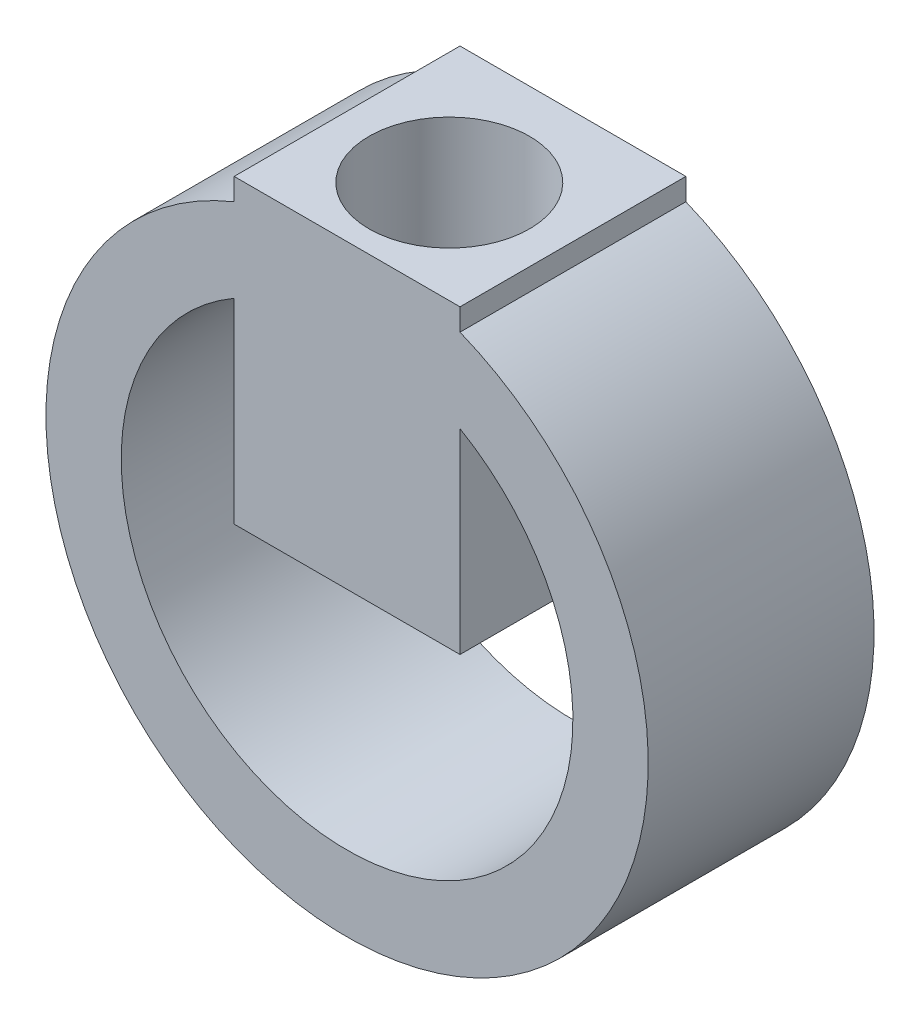
ISO-10303-21;
HEADER;
FILE_DESCRIPTION(('STEP AP214'),'2;1');
FILE_NAME('part.step','',(''),(''),'','','');
FILE_SCHEMA(('AUTOMOTIVE_DESIGN { 1 0 10303 214 1 1 1 1 }'));
ENDSEC;
DATA;
#1=APPLICATION_CONTEXT('core data for automotive mechanical design processes');
#2=APPLICATION_PROTOCOL_DEFINITION('international standard','automotive_design',2000,#1);
#3=PRODUCT_CONTEXT('',#1,'mechanical');
#4=PRODUCT('Part','Part','',(#3));
#5=PRODUCT_RELATED_PRODUCT_CATEGORY('part','',(#4));
#6=PRODUCT_DEFINITION_FORMATION('','',#4);
#7=PRODUCT_DEFINITION_CONTEXT('part definition',#1,'design');
#8=PRODUCT_DEFINITION('design','',#6,#7);
#9=PRODUCT_DEFINITION_SHAPE('','',#8);
#10=(LENGTH_UNIT() NAMED_UNIT(*) SI_UNIT(.MILLI.,.METRE.));
#11=(NAMED_UNIT(*) PLANE_ANGLE_UNIT() SI_UNIT($,.RADIAN.));
#12=(NAMED_UNIT(*) SI_UNIT($,.STERADIAN.) SOLID_ANGLE_UNIT());
#13=UNCERTAINTY_MEASURE_WITH_UNIT(LENGTH_MEASURE(1.E-05),#10,'distance_accuracy_value','');
#14=(GEOMETRIC_REPRESENTATION_CONTEXT(3) GLOBAL_UNCERTAINTY_ASSIGNED_CONTEXT((#13)) GLOBAL_UNIT_ASSIGNED_CONTEXT((#10,
#11,#12)) REPRESENTATION_CONTEXT('',''));
#15=CARTESIAN_POINT('',(0.,0.,0.));
#16=DIRECTION('',(0.,0.,1.));
#17=DIRECTION('',(1.,0.,0.));
#18=AXIS2_PLACEMENT_3D('',#15,#16,#17);
#19=CARTESIAN_POINT('',(0.,0.,19.05));
#20=DIRECTION('',(0.,0.,-1.));
#21=DIRECTION('',(-1.,0.,0.));
#22=AXIS2_PLACEMENT_3D('',#19,#20,#21);
#23=CYLINDRICAL_SURFACE('',#22,25.4);
#24=DIRECTION('',(0.,0.,-1.));
#25=VECTOR('',#24,1.);
#26=CARTESIAN_POINT('',(-9.525,23.5464301965287,19.05));
#27=LINE('',#26,#25);
#28=CARTESIAN_POINT('',(-9.525,23.5464301965287,0.));
#29=VERTEX_POINT('',#28);
#30=CARTESIAN_POINT('',(-9.525,23.5464301965287,19.05));
#31=VERTEX_POINT('',#30);
#32=EDGE_CURVE('E128',#29,#31,#27,.F.);
#33=ORIENTED_EDGE('',*,*,#32,.F.);
#34=CARTESIAN_POINT('',(0.,0.,0.));
#35=DIRECTION('',(0.,0.,1.));
#36=DIRECTION('',(1.,0.,0.));
#37=AXIS2_PLACEMENT_3D('',#34,#35,#36);
#38=CIRCLE('',#37,25.4);
#39=CARTESIAN_POINT('',(9.525,23.5464301965287,0.));
#40=VERTEX_POINT('',#39);
#41=EDGE_CURVE('E148',#29,#40,#38,.T.);
#42=ORIENTED_EDGE('',*,*,#41,.T.);
#43=DIRECTION('',(0.,0.,-1.));
#44=VECTOR('',#43,1.);
#45=CARTESIAN_POINT('',(9.525,23.5464301965287,19.05));
#46=LINE('',#45,#44);
#47=CARTESIAN_POINT('',(9.525,23.5464301965287,19.05));
#48=VERTEX_POINT('',#47);
#49=EDGE_CURVE('E59',#48,#40,#46,.T.);
#50=ORIENTED_EDGE('',*,*,#49,.F.);
#51=CARTESIAN_POINT('',(0.,0.,19.05));
#52=DIRECTION('',(0.,0.,1.));
#53=DIRECTION('',(1.,0.,0.));
#54=AXIS2_PLACEMENT_3D('',#51,#52,#53);
#55=CIRCLE('',#54,25.4);
#56=EDGE_CURVE('E54',#31,#48,#55,.T.);
#57=ORIENTED_EDGE('',*,*,#56,.F.);
#58=EDGE_LOOP('',(#33,#42,#50,#57));
#59=FACE_BOUND('',#58,.T.);
#60=ADVANCED_FACE('F39',(#59),#23,.T.);
#61=CARTESIAN_POINT('',(0.,0.,0.));
#62=DIRECTION('',(0.,0.,1.));
#63=DIRECTION('',(1.,0.,0.));
#64=AXIS2_PLACEMENT_3D('',#61,#62,#63);
#65=CYLINDRICAL_SURFACE('',#64,19.05);
#66=DIRECTION('',(0.,0.,1.));
#67=VECTOR('',#66,1.);
#68=CARTESIAN_POINT('',(-9.525,16.4977839420936,0.));
#69=LINE('',#68,#67);
#70=CARTESIAN_POINT('',(-9.525,16.4977839420936,19.05));
#71=VERTEX_POINT('',#70);
#72=CARTESIAN_POINT('',(-9.525,16.4977839420936,0.));
#73=VERTEX_POINT('',#72);
#74=EDGE_CURVE('E11',#71,#73,#69,.F.);
#75=ORIENTED_EDGE('',*,*,#74,.F.);
#76=CARTESIAN_POINT('',(0.,0.,19.05));
#77=DIRECTION('',(0.,0.,1.));
#78=DIRECTION('',(1.,0.,0.));
#79=AXIS2_PLACEMENT_3D('',#76,#77,#78);
#80=CIRCLE('',#79,19.05);
#81=CARTESIAN_POINT('',(9.525,16.4977839420936,19.05));
#82=VERTEX_POINT('',#81);
#83=EDGE_CURVE('E144',#71,#82,#80,.T.);
#84=ORIENTED_EDGE('',*,*,#83,.T.);
#85=DIRECTION('',(0.,0.,1.));
#86=VECTOR('',#85,1.);
#87=CARTESIAN_POINT('',(9.525,16.4977839420936,0.));
#88=LINE('',#87,#86);
#89=CARTESIAN_POINT('',(9.525,16.4977839420936,0.));
#90=VERTEX_POINT('',#89);
#91=EDGE_CURVE('E47',#90,#82,#88,.T.);
#92=ORIENTED_EDGE('',*,*,#91,.F.);
#93=CARTESIAN_POINT('',(0.,0.,0.));
#94=DIRECTION('',(0.,0.,1.));
#95=DIRECTION('',(1.,0.,0.));
#96=AXIS2_PLACEMENT_3D('',#93,#94,#95);
#97=CIRCLE('',#96,19.05);
#98=EDGE_CURVE('E140',#73,#90,#97,.T.);
#99=ORIENTED_EDGE('',*,*,#98,.F.);
#100=EDGE_LOOP('',(#75,#84,#92,#99));
#101=FACE_BOUND('',#100,.T.);
#102=ADVANCED_FACE('F170',(#101),#65,.F.);
#103=CARTESIAN_POINT('',(0.,0.,19.05));
#104=DIRECTION('',(0.,0.,1.));
#105=DIRECTION('',(1.,0.,0.));
#106=AXIS2_PLACEMENT_3D('',#103,#104,#105);
#107=PLANE('',#106);
#108=DIRECTION('',(1.,0.,0.));
#109=VECTOR('',#108,1.);
#110=CARTESIAN_POINT('',(9.525,25.4,19.05));
#111=LINE('',#110,#109);
#112=CARTESIAN_POINT('',(-9.525,25.4,19.05));
#113=VERTEX_POINT('',#112);
#114=CARTESIAN_POINT('',(9.525,25.4,19.05));
#115=VERTEX_POINT('',#114);
#116=EDGE_CURVE('E103',#113,#115,#111,.T.);
#117=ORIENTED_EDGE('',*,*,#116,.F.);
#118=DIRECTION('',(0.,-1.,0.));
#119=VECTOR('',#118,1.);
#120=CARTESIAN_POINT('',(-9.525,25.4,19.05));
#121=LINE('',#120,#119);
#122=EDGE_CURVE('E108',#113,#31,#121,.T.);
#123=ORIENTED_EDGE('',*,*,#122,.T.);
#124=ORIENTED_EDGE('',*,*,#56,.T.);
#125=DIRECTION('',(0.,-1.,0.));
#126=VECTOR('',#125,1.);
#127=CARTESIAN_POINT('',(9.525,25.4,19.05));
#128=LINE('',#127,#126);
#129=EDGE_CURVE('E110',#115,#48,#128,.T.);
#130=ORIENTED_EDGE('',*,*,#129,.F.);
#131=EDGE_LOOP('',(#117,#123,#124,#130));
#132=FACE_BOUND('',#131,.T.);
#133=ORIENTED_EDGE('',*,*,#83,.F.);
#134=CARTESIAN_POINT('',(-9.525,0.,19.05));
#135=VERTEX_POINT('',#134);
#136=EDGE_CURVE('E130',#71,#135,#121,.T.);
#137=ORIENTED_EDGE('',*,*,#136,.T.);
#138=DIRECTION('',(1.,0.,0.));
#139=VECTOR('',#138,1.);
#140=CARTESIAN_POINT('',(9.525,0.,19.05));
#141=LINE('',#140,#139);
#142=CARTESIAN_POINT('',(9.525,0.,19.05));
#143=VERTEX_POINT('',#142);
#144=EDGE_CURVE('E165',#135,#143,#141,.T.);
#145=ORIENTED_EDGE('',*,*,#144,.T.);
#146=EDGE_CURVE('E158',#82,#143,#128,.T.);
#147=ORIENTED_EDGE('',*,*,#146,.F.);
#148=EDGE_LOOP('',(#133,#137,#145,#147));
#149=FACE_BOUND('',#148,.T.);
#150=ADVANCED_FACE('F105',(#132,#149),#107,.T.);
#151=CARTESIAN_POINT('',(0.,0.,0.));
#152=DIRECTION('',(0.,0.,1.));
#153=DIRECTION('',(1.,0.,0.));
#154=AXIS2_PLACEMENT_3D('',#151,#152,#153);
#155=PLANE('',#154);
#156=ORIENTED_EDGE('',*,*,#41,.F.);
#157=DIRECTION('',(0.,-1.,0.));
#158=VECTOR('',#157,1.);
#159=CARTESIAN_POINT('',(-9.525,25.4,0.));
#160=LINE('',#159,#158);
#161=CARTESIAN_POINT('',(-9.525,25.4,0.));
#162=VERTEX_POINT('',#161);
#163=EDGE_CURVE('E193',#162,#29,#160,.T.);
#164=ORIENTED_EDGE('',*,*,#163,.F.);
#165=DIRECTION('',(-1.,0.,0.));
#166=VECTOR('',#165,1.);
#167=CARTESIAN_POINT('',(9.525,25.4,0.));
#168=LINE('',#167,#166);
#169=CARTESIAN_POINT('',(9.525,25.4,0.));
#170=VERTEX_POINT('',#169);
#171=EDGE_CURVE('E120',#170,#162,#168,.T.);
#172=ORIENTED_EDGE('',*,*,#171,.F.);
#173=DIRECTION('',(0.,-1.,0.));
#174=VECTOR('',#173,1.);
#175=CARTESIAN_POINT('',(9.525,25.4,0.));
#176=LINE('',#175,#174);
#177=EDGE_CURVE('E168',#170,#40,#176,.T.);
#178=ORIENTED_EDGE('',*,*,#177,.T.);
#179=EDGE_LOOP('',(#156,#164,#172,#178));
#180=FACE_BOUND('',#179,.T.);
#181=CARTESIAN_POINT('',(-9.525,0.,0.));
#182=VERTEX_POINT('',#181);
#183=EDGE_CURVE('E174',#73,#182,#160,.T.);
#184=ORIENTED_EDGE('',*,*,#183,.F.);
#185=ORIENTED_EDGE('',*,*,#98,.T.);
#186=CARTESIAN_POINT('',(9.525,0.,0.));
#187=VERTEX_POINT('',#186);
#188=EDGE_CURVE('E160',#90,#187,#176,.T.);
#189=ORIENTED_EDGE('',*,*,#188,.T.);
#190=DIRECTION('',(-1.,0.,0.));
#191=VECTOR('',#190,1.);
#192=CARTESIAN_POINT('',(9.525,0.,0.));
#193=LINE('',#192,#191);
#194=EDGE_CURVE('E125',#187,#182,#193,.T.);
#195=ORIENTED_EDGE('',*,*,#194,.T.);
#196=EDGE_LOOP('',(#184,#185,#189,#195));
#197=FACE_BOUND('',#196,.T.);
#198=ADVANCED_FACE('F201',(#180,#197),#155,.F.);
#199=CARTESIAN_POINT('',(0.,0.,0.));
#200=DIRECTION('',(0.,1.,0.));
#201=DIRECTION('',(0.,0.,1.));
#202=AXIS2_PLACEMENT_3D('',#199,#200,#201);
#203=PLANE('',#202);
#204=CARTESIAN_POINT('',(0.,0.,10.4276319197537));
#205=DIRECTION('',(0.,1.,0.));
#206=DIRECTION('',(0.,0.,1.));
#207=AXIS2_PLACEMENT_3D('',#204,#205,#206);
#208=CIRCLE('',#207,6.76973939815284);
#209=CARTESIAN_POINT('',(0.,0.,17.1973713179066));
#210=VERTEX_POINT('',#209);
#211=EDGE_CURVE('E207',#210,#210,#208,.T.);
#212=ORIENTED_EDGE('',*,*,#211,.T.);
#213=EDGE_LOOP('',(#212));
#214=FACE_BOUND('',#213,.T.);
#215=DIRECTION('',(0.,0.,1.));
#216=VECTOR('',#215,1.);
#217=CARTESIAN_POINT('',(-9.525,0.,19.05));
#218=LINE('',#217,#216);
#219=EDGE_CURVE('E177',#182,#135,#218,.T.);
#220=ORIENTED_EDGE('',*,*,#219,.F.);
#221=ORIENTED_EDGE('',*,*,#194,.F.);
#222=DIRECTION('',(0.,0.,-1.));
#223=VECTOR('',#222,1.);
#224=CARTESIAN_POINT('',(9.525,0.,19.05));
#225=LINE('',#224,#223);
#226=EDGE_CURVE('E181',#143,#187,#225,.T.);
#227=ORIENTED_EDGE('',*,*,#226,.F.);
#228=ORIENTED_EDGE('',*,*,#144,.F.);
#229=EDGE_LOOP('',(#220,#221,#227,#228));
#230=FACE_BOUND('',#229,.T.);
#231=ADVANCED_FACE('F179',(#214,#230),#203,.F.);
#232=CARTESIAN_POINT('',(9.525,25.4,19.05));
#233=DIRECTION('',(-1.,0.,0.));
#234=DIRECTION('',(0.,0.,1.));
#235=AXIS2_PLACEMENT_3D('',#232,#233,#234);
#236=PLANE('',#235);
#237=ORIENTED_EDGE('',*,*,#188,.F.);
#238=ORIENTED_EDGE('',*,*,#91,.T.);
#239=ORIENTED_EDGE('',*,*,#146,.T.);
#240=ORIENTED_EDGE('',*,*,#226,.T.);
#241=EDGE_LOOP('',(#237,#238,#239,#240));
#242=FACE_BOUND('',#241,.T.);
#243=ADVANCED_FACE('F156',(#242),#236,.F.);
#244=CARTESIAN_POINT('',(-9.525,25.4,19.05));
#245=DIRECTION('',(1.,0.,0.));
#246=DIRECTION('',(0.,0.,-1.));
#247=AXIS2_PLACEMENT_3D('',#244,#245,#246);
#248=PLANE('',#247);
#249=ORIENTED_EDGE('',*,*,#136,.F.);
#250=ORIENTED_EDGE('',*,*,#74,.T.);
#251=ORIENTED_EDGE('',*,*,#183,.T.);
#252=ORIENTED_EDGE('',*,*,#219,.T.);
#253=EDGE_LOOP('',(#249,#250,#251,#252));
#254=FACE_BOUND('',#253,.T.);
#255=ADVANCED_FACE('F172',(#254),#248,.F.);
#256=CARTESIAN_POINT('',(0.,25.4,0.));
#257=DIRECTION('',(0.,1.,0.));
#258=DIRECTION('',(0.,0.,1.));
#259=AXIS2_PLACEMENT_3D('',#256,#257,#258);
#260=PLANE('',#259);
#261=CARTESIAN_POINT('',(0.,25.4,10.4276319197537));
#262=DIRECTION('',(0.,1.,0.));
#263=DIRECTION('',(0.,0.,1.));
#264=AXIS2_PLACEMENT_3D('',#261,#262,#263);
#265=CIRCLE('',#264,6.76973939815284);
#266=CARTESIAN_POINT('',(0.,25.4,17.1973713179066));
#267=VERTEX_POINT('',#266);
#268=EDGE_CURVE('E187',#267,#267,#265,.T.);
#269=ORIENTED_EDGE('',*,*,#268,.F.);
#270=EDGE_LOOP('',(#269));
#271=FACE_BOUND('',#270,.T.);
#272=ORIENTED_EDGE('',*,*,#171,.T.);
#273=DIRECTION('',(0.,0.,1.));
#274=VECTOR('',#273,1.);
#275=CARTESIAN_POINT('',(-9.525,25.4,19.05));
#276=LINE('',#275,#274);
#277=EDGE_CURVE('E115',#162,#113,#276,.T.);
#278=ORIENTED_EDGE('',*,*,#277,.T.);
#279=ORIENTED_EDGE('',*,*,#116,.T.);
#280=DIRECTION('',(0.,0.,-1.));
#281=VECTOR('',#280,1.);
#282=CARTESIAN_POINT('',(9.525,25.4,19.05));
#283=LINE('',#282,#281);
#284=EDGE_CURVE('E114',#115,#170,#283,.T.);
#285=ORIENTED_EDGE('',*,*,#284,.T.);
#286=EDGE_LOOP('',(#272,#278,#279,#285));
#287=FACE_BOUND('',#286,.T.);
#288=ADVANCED_FACE('F118',(#271,#287),#260,.T.);
#289=ORIENTED_EDGE('',*,*,#163,.T.);
#290=ORIENTED_EDGE('',*,*,#32,.T.);
#291=ORIENTED_EDGE('',*,*,#122,.F.);
#292=ORIENTED_EDGE('',*,*,#277,.F.);
#293=EDGE_LOOP('',(#289,#290,#291,#292));
#294=FACE_BOUND('',#293,.T.);
#295=ADVANCED_FACE('F127',(#294),#248,.F.);
#296=ORIENTED_EDGE('',*,*,#129,.T.);
#297=ORIENTED_EDGE('',*,*,#49,.T.);
#298=ORIENTED_EDGE('',*,*,#177,.F.);
#299=ORIENTED_EDGE('',*,*,#284,.F.);
#300=EDGE_LOOP('',(#296,#297,#298,#299));
#301=FACE_BOUND('',#300,.T.);
#302=ADVANCED_FACE('F224',(#301),#236,.F.);
#303=CARTESIAN_POINT('',(0.,25.4,10.4276319197537));
#304=DIRECTION('',(0.,-1.,0.));
#305=DIRECTION('',(0.,0.,-1.));
#306=AXIS2_PLACEMENT_3D('',#303,#304,#305);
#307=CYLINDRICAL_SURFACE('',#306,6.76973939815284);
#308=ORIENTED_EDGE('',*,*,#268,.T.);
#309=EDGE_LOOP('',(#308));
#310=FACE_BOUND('',#309,.T.);
#311=ORIENTED_EDGE('',*,*,#211,.F.);
#312=EDGE_LOOP('',(#311));
#313=FACE_BOUND('',#312,.T.);
#314=ADVANCED_FACE('F215',(#310,#313),#307,.F.);
#315=CLOSED_SHELL('',(#60,#102,#150,#198,#231,#243,#255,#288,#295,#302,#314));
#316=MANIFOLD_SOLID_BREP('B2',#315);
#317=ADVANCED_BREP_SHAPE_REPRESENTATION('',(#18,#316),#14);
#318=SHAPE_DEFINITION_REPRESENTATION(#9,#317);
ENDSEC;
END-ISO-10303-21;
